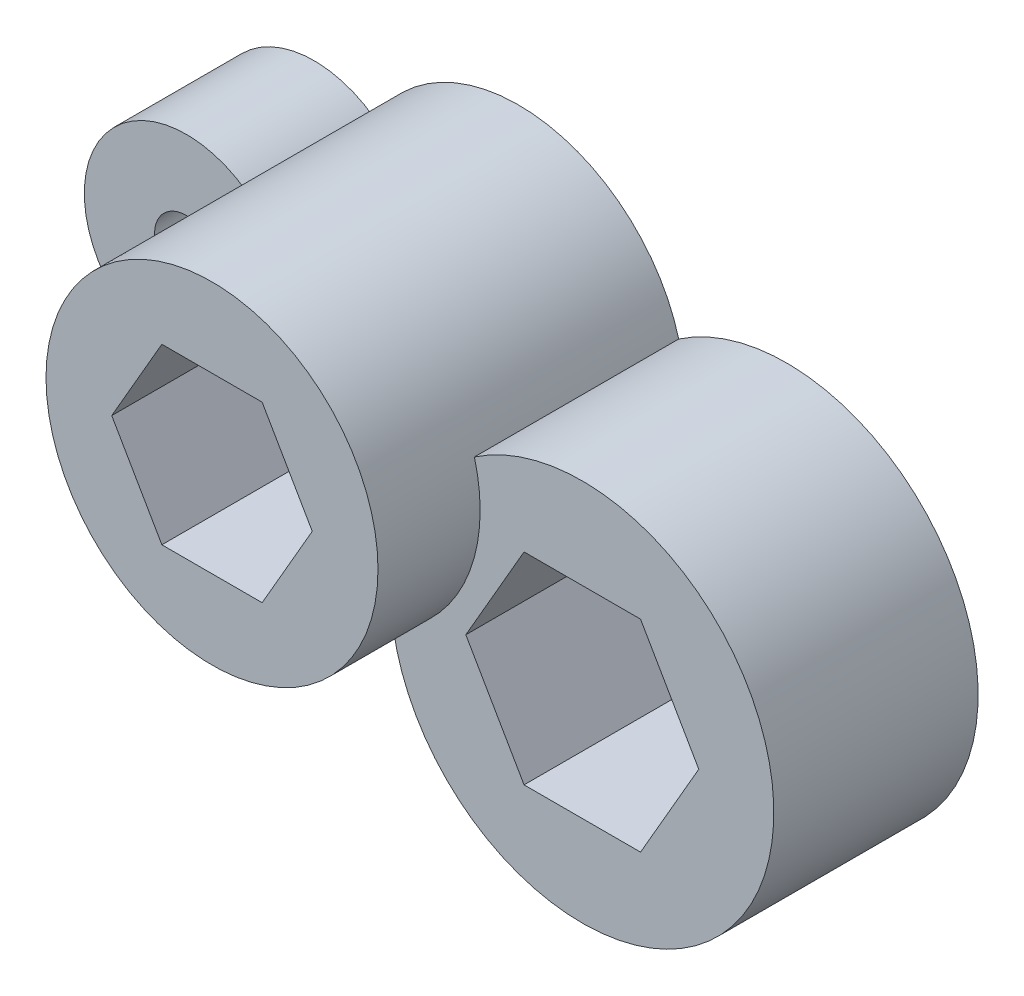
ISO-10303-21;
HEADER;
FILE_DESCRIPTION(('STEP AP214'),'2;1');
FILE_NAME('part.step','',(''),(''),'','','');
FILE_SCHEMA(('AUTOMOTIVE_DESIGN { 1 0 10303 214 1 1 1 1 }'));
ENDSEC;
DATA;
#1=APPLICATION_CONTEXT('core data for automotive mechanical design processes');
#2=APPLICATION_PROTOCOL_DEFINITION('international standard','automotive_design',2000,#1);
#3=PRODUCT_CONTEXT('',#1,'mechanical');
#4=PRODUCT('Part','Part','',(#3));
#5=PRODUCT_RELATED_PRODUCT_CATEGORY('part','',(#4));
#6=PRODUCT_DEFINITION_FORMATION('','',#4);
#7=PRODUCT_DEFINITION_CONTEXT('part definition',#1,'design');
#8=PRODUCT_DEFINITION('design','',#6,#7);
#9=PRODUCT_DEFINITION_SHAPE('','',#8);
#10=(LENGTH_UNIT() NAMED_UNIT(*) SI_UNIT(.MILLI.,.METRE.));
#11=(NAMED_UNIT(*) PLANE_ANGLE_UNIT() SI_UNIT($,.RADIAN.));
#12=(NAMED_UNIT(*) SI_UNIT($,.STERADIAN.) SOLID_ANGLE_UNIT());
#13=UNCERTAINTY_MEASURE_WITH_UNIT(LENGTH_MEASURE(1.E-05),#10,'distance_accuracy_value','');
#14=(GEOMETRIC_REPRESENTATION_CONTEXT(3) GLOBAL_UNCERTAINTY_ASSIGNED_CONTEXT((#13)) GLOBAL_UNIT_ASSIGNED_CONTEXT((#10,
#11,#12)) REPRESENTATION_CONTEXT('',''));
#15=CARTESIAN_POINT('',(0.,0.,0.));
#16=DIRECTION('',(0.,0.,1.));
#17=DIRECTION('',(1.,0.,0.));
#18=AXIS2_PLACEMENT_3D('',#15,#16,#17);
#19=CARTESIAN_POINT('',(0.,0.,8.));
#20=DIRECTION('',(0.,0.,-1.));
#21=DIRECTION('',(1.,0.,0.));
#22=AXIS2_PLACEMENT_3D('',#19,#20,#21);
#23=CYLINDRICAL_SURFACE('',#22,7.5);
#24=DIRECTION('',(0.,0.,-1.));
#25=VECTOR('',#24,1.);
#26=CARTESIAN_POINT('',(-7.40113444899148,-1.21375815875798,6.));
#27=LINE('',#26,#25);
#28=CARTESIAN_POINT('',(-7.40113444899148,-1.21375815875798,8.));
#29=VERTEX_POINT('',#28);
#30=CARTESIAN_POINT('',(-7.40113444899148,-1.21375815875798,0.));
#31=VERTEX_POINT('',#30);
#32=EDGE_CURVE('E173',#29,#31,#27,.T.);
#33=ORIENTED_EDGE('',*,*,#32,.T.);
#34=CARTESIAN_POINT('',(0.,0.,0.));
#35=DIRECTION('',(0.,0.,1.));
#36=DIRECTION('',(1.,0.,0.));
#37=AXIS2_PLACEMENT_3D('',#34,#35,#36);
#38=CIRCLE('',#37,7.5);
#39=CARTESIAN_POINT('',(-4.22530233261804,6.19651677944735,0.));
#40=VERTEX_POINT('',#39);
#41=EDGE_CURVE('E215',#31,#40,#38,.T.);
#42=ORIENTED_EDGE('',*,*,#41,.T.);
#43=DIRECTION('',(0.,0.,-1.));
#44=VECTOR('',#43,1.);
#45=CARTESIAN_POINT('',(-4.22530233261804,6.19651677944735,6.));
#46=LINE('',#45,#44);
#47=CARTESIAN_POINT('',(-4.22530233261804,6.19651677944735,8.));
#48=VERTEX_POINT('',#47);
#49=EDGE_CURVE('E162',#40,#48,#46,.F.);
#50=ORIENTED_EDGE('',*,*,#49,.T.);
#51=CARTESIAN_POINT('',(0.,0.,8.));
#52=DIRECTION('',(0.,0.,1.));
#53=DIRECTION('',(1.,0.,0.));
#54=AXIS2_PLACEMENT_3D('',#51,#52,#53);
#55=CIRCLE('',#54,7.5);
#56=EDGE_CURVE('E225',#29,#48,#55,.T.);
#57=ORIENTED_EDGE('',*,*,#56,.F.);
#58=EDGE_LOOP('',(#33,#42,#50,#57));
#59=FACE_BOUND('',#58,.T.);
#60=ADVANCED_FACE('F33',(#59),#23,.T.);
#61=CARTESIAN_POINT('',(0.,0.,8.));
#62=DIRECTION('',(0.,0.,-1.));
#63=DIRECTION('',(1.,0.,0.));
#64=AXIS2_PLACEMENT_3D('',#61,#62,#63);
#65=PLANE('',#64);
#66=DIRECTION('',(0.5,-0.866025403784439,0.));
#67=VECTOR('',#66,1.);
#68=CARTESIAN_POINT('',(-4.56106712659804,0.,8.));
#69=LINE('',#68,#67);
#70=CARTESIAN_POINT('',(-4.56106712659804,0.,8.));
#71=VERTEX_POINT('',#70);
#72=CARTESIAN_POINT('',(-2.28053356329902,-3.95,8.));
#73=VERTEX_POINT('',#72);
#74=EDGE_CURVE('E193',#71,#73,#69,.T.);
#75=ORIENTED_EDGE('',*,*,#74,.F.);
#76=DIRECTION('',(-0.5,-0.866025403784439,0.));
#77=VECTOR('',#76,1.);
#78=CARTESIAN_POINT('',(-2.28053356329902,3.95,8.));
#79=LINE('',#78,#77);
#80=CARTESIAN_POINT('',(-2.28053356329902,3.95,8.));
#81=VERTEX_POINT('',#80);
#82=EDGE_CURVE('E190',#81,#71,#79,.T.);
#83=ORIENTED_EDGE('',*,*,#82,.F.);
#84=DIRECTION('',(-1.,0.,0.));
#85=VECTOR('',#84,1.);
#86=CARTESIAN_POINT('',(2.28053356329902,3.95,8.));
#87=LINE('',#86,#85);
#88=CARTESIAN_POINT('',(2.28053356329902,3.95,8.));
#89=VERTEX_POINT('',#88);
#90=EDGE_CURVE('E187',#89,#81,#87,.T.);
#91=ORIENTED_EDGE('',*,*,#90,.F.);
#92=DIRECTION('',(-0.5,0.866025403784439,0.));
#93=VECTOR('',#92,1.);
#94=CARTESIAN_POINT('',(4.56106712659804,0.,8.));
#95=LINE('',#94,#93);
#96=CARTESIAN_POINT('',(4.56106712659804,0.,8.));
#97=VERTEX_POINT('',#96);
#98=EDGE_CURVE('E184',#97,#89,#95,.T.);
#99=ORIENTED_EDGE('',*,*,#98,.F.);
#100=DIRECTION('',(0.5,0.866025403784439,0.));
#101=VECTOR('',#100,1.);
#102=CARTESIAN_POINT('',(2.28053356329902,-3.95,8.));
#103=LINE('',#102,#101);
#104=CARTESIAN_POINT('',(2.28053356329902,-3.95,8.));
#105=VERTEX_POINT('',#104);
#106=EDGE_CURVE('E180',#105,#97,#103,.T.);
#107=ORIENTED_EDGE('',*,*,#106,.F.);
#108=DIRECTION('',(1.,0.,0.));
#109=VECTOR('',#108,1.);
#110=CARTESIAN_POINT('',(-2.28053356329902,-3.95,8.));
#111=LINE('',#110,#109);
#112=EDGE_CURVE('E177',#73,#105,#111,.T.);
#113=ORIENTED_EDGE('',*,*,#112,.F.);
#114=EDGE_LOOP('',(#75,#83,#91,#99,#107,#113));
#115=FACE_BOUND('',#114,.T.);
#116=ORIENTED_EDGE('',*,*,#56,.T.);
#117=CARTESIAN_POINT('',(-10.5000000000009,4.5,8.));
#118=DIRECTION('',(0.,0.,1.));
#119=DIRECTION('',(1.,0.,0.));
#120=AXIS2_PLACEMENT_3D('',#117,#118,#119);
#121=CIRCLE('',#120,6.50000000000048);
#122=EDGE_CURVE('E52',#29,#48,#121,.T.);
#123=ORIENTED_EDGE('',*,*,#122,.F.);
#124=EDGE_LOOP('',(#116,#123));
#125=FACE_BOUND('',#124,.T.);
#126=ADVANCED_FACE('F319',(#115,#125),#65,.F.);
#127=CARTESIAN_POINT('',(0.,0.,0.));
#128=DIRECTION('',(0.,0.,-1.));
#129=DIRECTION('',(1.,0.,0.));
#130=AXIS2_PLACEMENT_3D('',#127,#128,#129);
#131=PLANE('',#130);
#132=CARTESIAN_POINT('',(-10.5000000000009,4.5,0.));
#133=DIRECTION('',(0.,0.,1.));
#134=DIRECTION('',(1.,0.,0.));
#135=AXIS2_PLACEMENT_3D('',#132,#133,#134);
#136=CIRCLE('',#135,6.50000000000048);
#137=CARTESIAN_POINT('',(-16.1406250000013,7.73006959822488,0.));
#138=VERTEX_POINT('',#137);
#139=EDGE_CURVE('E155',#40,#138,#136,.T.);
#140=ORIENTED_EDGE('',*,*,#139,.F.);
#141=ORIENTED_EDGE('',*,*,#41,.F.);
#142=CARTESIAN_POINT('',(-16.1406250000013,1.26993040177507,0.));
#143=VERTEX_POINT('',#142);
#144=EDGE_CURVE('E156',#143,#31,#136,.T.);
#145=ORIENTED_EDGE('',*,*,#144,.F.);
#146=CARTESIAN_POINT('',(-18.5000000000009,4.49999999999996,0.));
#147=DIRECTION('',(0.,0.,1.));
#148=DIRECTION('',(1.,0.,0.));
#149=AXIS2_PLACEMENT_3D('',#146,#147,#148);
#150=CIRCLE('',#149,4.);
#151=EDGE_CURVE('E145',#138,#143,#150,.T.);
#152=ORIENTED_EDGE('',*,*,#151,.F.);
#153=EDGE_LOOP('',(#140,#141,#145,#152));
#154=FACE_BOUND('',#153,.T.);
#155=DIRECTION('',(1.,0.,0.));
#156=VECTOR('',#155,1.);
#157=CARTESIAN_POINT('',(-2.28053356329902,-3.95,0.));
#158=LINE('',#157,#156);
#159=CARTESIAN_POINT('',(-2.28053356329902,-3.95,0.));
#160=VERTEX_POINT('',#159);
#161=CARTESIAN_POINT('',(2.28053356329902,-3.95,0.));
#162=VERTEX_POINT('',#161);
#163=EDGE_CURVE('E176',#160,#162,#158,.T.);
#164=ORIENTED_EDGE('',*,*,#163,.T.);
#165=DIRECTION('',(0.5,0.866025403784439,0.));
#166=VECTOR('',#165,1.);
#167=CARTESIAN_POINT('',(2.28053356329902,-3.95,0.));
#168=LINE('',#167,#166);
#169=CARTESIAN_POINT('',(4.56106712659804,0.,0.));
#170=VERTEX_POINT('',#169);
#171=EDGE_CURVE('E199',#162,#170,#168,.T.);
#172=ORIENTED_EDGE('',*,*,#171,.T.);
#173=DIRECTION('',(-0.5,0.866025403784439,0.));
#174=VECTOR('',#173,1.);
#175=CARTESIAN_POINT('',(4.56106712659804,0.,0.));
#176=LINE('',#175,#174);
#177=CARTESIAN_POINT('',(2.28053356329902,3.95,0.));
#178=VERTEX_POINT('',#177);
#179=EDGE_CURVE('E202',#170,#178,#176,.T.);
#180=ORIENTED_EDGE('',*,*,#179,.T.);
#181=DIRECTION('',(-1.,0.,0.));
#182=VECTOR('',#181,1.);
#183=CARTESIAN_POINT('',(2.28053356329902,3.95,0.));
#184=LINE('',#183,#182);
#185=CARTESIAN_POINT('',(-2.28053356329902,3.95,0.));
#186=VERTEX_POINT('',#185);
#187=EDGE_CURVE('E205',#178,#186,#184,.T.);
#188=ORIENTED_EDGE('',*,*,#187,.T.);
#189=DIRECTION('',(-0.5,-0.866025403784439,0.));
#190=VECTOR('',#189,1.);
#191=CARTESIAN_POINT('',(-2.28053356329902,3.95,0.));
#192=LINE('',#191,#190);
#193=CARTESIAN_POINT('',(-4.56106712659804,0.,0.));
#194=VERTEX_POINT('',#193);
#195=EDGE_CURVE('E208',#186,#194,#192,.T.);
#196=ORIENTED_EDGE('',*,*,#195,.T.);
#197=DIRECTION('',(0.5,-0.866025403784439,0.));
#198=VECTOR('',#197,1.);
#199=CARTESIAN_POINT('',(-4.56106712659804,0.,0.));
#200=LINE('',#199,#198);
#201=EDGE_CURVE('E181',#194,#160,#200,.T.);
#202=ORIENTED_EDGE('',*,*,#201,.T.);
#203=EDGE_LOOP('',(#164,#172,#180,#188,#196,#202));
#204=FACE_BOUND('',#203,.T.);
#205=DIRECTION('',(1.,0.,0.));
#206=VECTOR('',#205,1.);
#207=CARTESIAN_POINT('',(-12.4629909152456,1.1,0.));
#208=LINE('',#207,#206);
#209=CARTESIAN_POINT('',(-12.4629909152456,1.1,0.));
#210=VERTEX_POINT('',#209);
#211=CARTESIAN_POINT('',(-8.53700908475617,1.1,0.));
#212=VERTEX_POINT('',#211);
#213=EDGE_CURVE('E231',#210,#212,#208,.T.);
#214=ORIENTED_EDGE('',*,*,#213,.T.);
#215=DIRECTION('',(0.5,0.866025403784439,0.));
#216=VECTOR('',#215,1.);
#217=CARTESIAN_POINT('',(-8.53700908475617,1.1,0.));
#218=LINE('',#217,#216);
#219=CARTESIAN_POINT('',(-6.57401816951144,4.5,0.));
#220=VERTEX_POINT('',#219);
#221=EDGE_CURVE('E234',#212,#220,#218,.T.);
#222=ORIENTED_EDGE('',*,*,#221,.T.);
#223=DIRECTION('',(-0.5,0.866025403784438,0.));
#224=VECTOR('',#223,1.);
#225=CARTESIAN_POINT('',(-6.57401816951144,4.5,0.));
#226=LINE('',#225,#224);
#227=CARTESIAN_POINT('',(-8.53700908475616,7.89999999999999,0.));
#228=VERTEX_POINT('',#227);
#229=EDGE_CURVE('E262',#220,#228,#226,.T.);
#230=ORIENTED_EDGE('',*,*,#229,.T.);
#231=DIRECTION('',(-1.,0.,0.));
#232=VECTOR('',#231,1.);
#233=CARTESIAN_POINT('',(-8.53700908475616,7.89999999999999,0.));
#234=LINE('',#233,#232);
#235=CARTESIAN_POINT('',(-12.4629909152453,7.89999999999999,0.));
#236=VERTEX_POINT('',#235);
#237=EDGE_CURVE('E265',#228,#236,#234,.T.);
#238=ORIENTED_EDGE('',*,*,#237,.T.);
#239=DIRECTION('',(-0.500000000000056,-0.866025403784406,0.));
#240=VECTOR('',#239,1.);
#241=CARTESIAN_POINT('',(-12.4629909152453,7.89999999999999,0.));
#242=LINE('',#241,#240);
#243=CARTESIAN_POINT('',(-14.4259818304903,4.5,0.));
#244=VERTEX_POINT('',#243);
#245=EDGE_CURVE('E268',#236,#244,#242,.T.);
#246=ORIENTED_EDGE('',*,*,#245,.T.);
#247=DIRECTION('',(0.5,-0.866025403784439,0.));
#248=VECTOR('',#247,1.);
#249=CARTESIAN_POINT('',(-14.4259818304903,4.5,0.));
#250=LINE('',#249,#248);
#251=EDGE_CURVE('E244',#244,#210,#250,.T.);
#252=ORIENTED_EDGE('',*,*,#251,.T.);
#253=EDGE_LOOP('',(#214,#222,#230,#238,#246,#252));
#254=FACE_BOUND('',#253,.T.);
#255=CARTESIAN_POINT('',(-18.5000000000009,4.49999999999996,0.));
#256=DIRECTION('',(0.,0.,1.));
#257=DIRECTION('',(1.,0.,0.));
#258=AXIS2_PLACEMENT_3D('',#255,#256,#257);
#259=CIRCLE('',#258,1.25000000000104);
#260=CARTESIAN_POINT('',(-17.2499999999999,4.49999999999996,0.));
#261=VERTEX_POINT('',#260);
#262=EDGE_CURVE('E237',#261,#261,#259,.T.);
#263=ORIENTED_EDGE('',*,*,#262,.T.);
#264=EDGE_LOOP('',(#263));
#265=FACE_BOUND('',#264,.T.);
#266=ADVANCED_FACE('F152',(#154,#204,#254,#265),#131,.T.);
#267=CARTESIAN_POINT('',(-2.28053356329902,-3.95,8.));
#268=DIRECTION('',(0.,-1.,0.));
#269=DIRECTION('',(1.,0.,0.));
#270=AXIS2_PLACEMENT_3D('',#267,#268,#269);
#271=PLANE('',#270);
#272=ORIENTED_EDGE('',*,*,#163,.F.);
#273=DIRECTION('',(0.,0.,-1.));
#274=VECTOR('',#273,1.);
#275=CARTESIAN_POINT('',(-2.28053356329902,-3.95,8.));
#276=LINE('',#275,#274);
#277=EDGE_CURVE('E213',#73,#160,#276,.T.);
#278=ORIENTED_EDGE('',*,*,#277,.F.);
#279=ORIENTED_EDGE('',*,*,#112,.T.);
#280=DIRECTION('',(0.,0.,-1.));
#281=VECTOR('',#280,1.);
#282=CARTESIAN_POINT('',(2.28053356329902,-3.95,8.));
#283=LINE('',#282,#281);
#284=EDGE_CURVE('E196',#105,#162,#283,.T.);
#285=ORIENTED_EDGE('',*,*,#284,.T.);
#286=EDGE_LOOP('',(#272,#278,#279,#285));
#287=FACE_BOUND('',#286,.T.);
#288=ADVANCED_FACE('F331',(#287),#271,.F.);
#289=CARTESIAN_POINT('',(-4.56106712659804,0.,8.));
#290=DIRECTION('',(-0.866025403784439,-0.5,0.));
#291=DIRECTION('',(0.5,-0.866025403784439,0.));
#292=AXIS2_PLACEMENT_3D('',#289,#290,#291);
#293=PLANE('',#292);
#294=ORIENTED_EDGE('',*,*,#201,.F.);
#295=DIRECTION('',(0.,0.,-1.));
#296=VECTOR('',#295,1.);
#297=CARTESIAN_POINT('',(-4.56106712659804,0.,8.));
#298=LINE('',#297,#296);
#299=EDGE_CURVE('E216',#71,#194,#298,.T.);
#300=ORIENTED_EDGE('',*,*,#299,.F.);
#301=ORIENTED_EDGE('',*,*,#74,.T.);
#302=ORIENTED_EDGE('',*,*,#277,.T.);
#303=EDGE_LOOP('',(#294,#300,#301,#302));
#304=FACE_BOUND('',#303,.T.);
#305=ADVANCED_FACE('F336',(#304),#293,.F.);
#306=CARTESIAN_POINT('',(-2.28053356329902,3.95,8.));
#307=DIRECTION('',(-0.866025403784439,0.5,0.));
#308=DIRECTION('',(-0.5,-0.866025403784439,0.));
#309=AXIS2_PLACEMENT_3D('',#306,#307,#308);
#310=PLANE('',#309);
#311=ORIENTED_EDGE('',*,*,#195,.F.);
#312=DIRECTION('',(0.,0.,-1.));
#313=VECTOR('',#312,1.);
#314=CARTESIAN_POINT('',(-2.28053356329902,3.95,8.));
#315=LINE('',#314,#313);
#316=EDGE_CURVE('E218',#81,#186,#315,.T.);
#317=ORIENTED_EDGE('',*,*,#316,.F.);
#318=ORIENTED_EDGE('',*,*,#82,.T.);
#319=ORIENTED_EDGE('',*,*,#299,.T.);
#320=EDGE_LOOP('',(#311,#317,#318,#319));
#321=FACE_BOUND('',#320,.T.);
#322=ADVANCED_FACE('F349',(#321),#310,.F.);
#323=CARTESIAN_POINT('',(2.28053356329902,3.95,8.));
#324=DIRECTION('',(0.,1.,0.));
#325=DIRECTION('',(-1.,0.,0.));
#326=AXIS2_PLACEMENT_3D('',#323,#324,#325);
#327=PLANE('',#326);
#328=ORIENTED_EDGE('',*,*,#187,.F.);
#329=DIRECTION('',(0.,0.,-1.));
#330=VECTOR('',#329,1.);
#331=CARTESIAN_POINT('',(2.28053356329902,3.95,8.));
#332=LINE('',#331,#330);
#333=EDGE_CURVE('E220',#89,#178,#332,.T.);
#334=ORIENTED_EDGE('',*,*,#333,.F.);
#335=ORIENTED_EDGE('',*,*,#90,.T.);
#336=ORIENTED_EDGE('',*,*,#316,.T.);
#337=EDGE_LOOP('',(#328,#334,#335,#336));
#338=FACE_BOUND('',#337,.T.);
#339=ADVANCED_FACE('F345',(#338),#327,.F.);
#340=CARTESIAN_POINT('',(4.56106712659804,0.,8.));
#341=DIRECTION('',(0.866025403784439,0.5,0.));
#342=DIRECTION('',(-0.5,0.866025403784439,0.));
#343=AXIS2_PLACEMENT_3D('',#340,#341,#342);
#344=PLANE('',#343);
#345=ORIENTED_EDGE('',*,*,#179,.F.);
#346=DIRECTION('',(0.,0.,-1.));
#347=VECTOR('',#346,1.);
#348=CARTESIAN_POINT('',(4.56106712659804,0.,8.));
#349=LINE('',#348,#347);
#350=EDGE_CURVE('E222',#97,#170,#349,.T.);
#351=ORIENTED_EDGE('',*,*,#350,.F.);
#352=ORIENTED_EDGE('',*,*,#98,.T.);
#353=ORIENTED_EDGE('',*,*,#333,.T.);
#354=EDGE_LOOP('',(#345,#351,#352,#353));
#355=FACE_BOUND('',#354,.T.);
#356=ADVANCED_FACE('F341',(#355),#344,.F.);
#357=CARTESIAN_POINT('',(2.28053356329902,-3.95,8.));
#358=DIRECTION('',(0.866025403784439,-0.5,0.));
#359=DIRECTION('',(0.5,0.866025403784439,0.));
#360=AXIS2_PLACEMENT_3D('',#357,#358,#359);
#361=PLANE('',#360);
#362=ORIENTED_EDGE('',*,*,#171,.F.);
#363=ORIENTED_EDGE('',*,*,#284,.F.);
#364=ORIENTED_EDGE('',*,*,#106,.T.);
#365=ORIENTED_EDGE('',*,*,#350,.T.);
#366=EDGE_LOOP('',(#362,#363,#364,#365));
#367=FACE_BOUND('',#366,.T.);
#368=ADVANCED_FACE('F338',(#367),#361,.F.);
#369=CARTESIAN_POINT('',(-10.5000000000009,4.5,12.));
#370=DIRECTION('',(0.,0.,-1.));
#371=DIRECTION('',(1.,0.,0.));
#372=AXIS2_PLACEMENT_3D('',#369,#370,#371);
#373=CYLINDRICAL_SURFACE('',#372,6.50000000000048);
#374=DIRECTION('',(0.,0.,-1.));
#375=VECTOR('',#374,1.);
#376=CARTESIAN_POINT('',(-16.1406250000013,1.26993040177507,2.5));
#377=LINE('',#376,#375);
#378=CARTESIAN_POINT('',(-16.1406250000013,1.26993040177506,5.));
#379=VERTEX_POINT('',#378);
#380=EDGE_CURVE('E11',#379,#143,#377,.T.);
#381=ORIENTED_EDGE('',*,*,#380,.T.);
#382=ORIENTED_EDGE('',*,*,#144,.T.);
#383=ORIENTED_EDGE('',*,*,#32,.F.);
#384=ORIENTED_EDGE('',*,*,#122,.T.);
#385=ORIENTED_EDGE('',*,*,#49,.F.);
#386=ORIENTED_EDGE('',*,*,#139,.T.);
#387=DIRECTION('',(0.,0.,-1.));
#388=VECTOR('',#387,1.);
#389=CARTESIAN_POINT('',(-16.1406250000013,7.73006959822488,2.5));
#390=LINE('',#389,#388);
#391=CARTESIAN_POINT('',(-16.1406250000013,7.73006959822488,5.));
#392=VERTEX_POINT('',#391);
#393=EDGE_CURVE('E40',#138,#392,#390,.F.);
#394=ORIENTED_EDGE('',*,*,#393,.T.);
#395=CARTESIAN_POINT('',(-10.5000000000009,4.5,5.));
#396=DIRECTION('',(0.,0.,1.));
#397=DIRECTION('',(1.,0.,0.));
#398=AXIS2_PLACEMENT_3D('',#395,#396,#397);
#399=CIRCLE('',#398,6.50000000000048);
#400=EDGE_CURVE('E150',#379,#392,#399,.F.);
#401=ORIENTED_EDGE('',*,*,#400,.F.);
#402=EDGE_LOOP('',(#381,#382,#383,#384,#385,#386,#394,#401));
#403=FACE_BOUND('',#402,.T.);
#404=CARTESIAN_POINT('',(-10.5000000000009,4.5,12.));
#405=DIRECTION('',(0.,0.,1.));
#406=DIRECTION('',(1.,0.,0.));
#407=AXIS2_PLACEMENT_3D('',#404,#405,#406);
#408=CIRCLE('',#407,6.50000000000048);
#409=CARTESIAN_POINT('',(-4.00000000000041,4.5,12.));
#410=VERTEX_POINT('',#409);
#411=EDGE_CURVE('E164',#410,#410,#408,.T.);
#412=ORIENTED_EDGE('',*,*,#411,.F.);
#413=EDGE_LOOP('',(#412));
#414=FACE_BOUND('',#413,.T.);
#415=ADVANCED_FACE('F159',(#403,#414),#373,.T.);
#416=CARTESIAN_POINT('',(-10.5000000000009,4.5,12.));
#417=DIRECTION('',(0.,0.,-1.));
#418=DIRECTION('',(1.,0.,0.));
#419=AXIS2_PLACEMENT_3D('',#416,#417,#418);
#420=PLANE('',#419);
#421=DIRECTION('',(0.5,-0.866025403784439,0.));
#422=VECTOR('',#421,1.);
#423=CARTESIAN_POINT('',(-14.4259818304903,4.5,12.));
#424=LINE('',#423,#422);
#425=CARTESIAN_POINT('',(-14.4259818304903,4.5,12.));
#426=VERTEX_POINT('',#425);
#427=CARTESIAN_POINT('',(-12.4629909152456,1.1,12.));
#428=VERTEX_POINT('',#427);
#429=EDGE_CURVE('E256',#426,#428,#424,.T.);
#430=ORIENTED_EDGE('',*,*,#429,.F.);
#431=DIRECTION('',(-0.500000000000056,-0.866025403784406,0.));
#432=VECTOR('',#431,1.);
#433=CARTESIAN_POINT('',(-12.4629909152453,7.89999999999999,12.));
#434=LINE('',#433,#432);
#435=CARTESIAN_POINT('',(-12.4629909152453,7.89999999999999,12.));
#436=VERTEX_POINT('',#435);
#437=EDGE_CURVE('E253',#436,#426,#434,.T.);
#438=ORIENTED_EDGE('',*,*,#437,.F.);
#439=DIRECTION('',(-1.,0.,0.));
#440=VECTOR('',#439,1.);
#441=CARTESIAN_POINT('',(-8.53700908475616,7.89999999999999,12.));
#442=LINE('',#441,#440);
#443=CARTESIAN_POINT('',(-8.53700908475616,7.89999999999999,12.));
#444=VERTEX_POINT('',#443);
#445=EDGE_CURVE('E250',#444,#436,#442,.T.);
#446=ORIENTED_EDGE('',*,*,#445,.F.);
#447=DIRECTION('',(-0.5,0.866025403784438,0.));
#448=VECTOR('',#447,1.);
#449=CARTESIAN_POINT('',(-6.57401816951144,4.5,12.));
#450=LINE('',#449,#448);
#451=CARTESIAN_POINT('',(-6.57401816951144,4.5,12.));
#452=VERTEX_POINT('',#451);
#453=EDGE_CURVE('E247',#452,#444,#450,.T.);
#454=ORIENTED_EDGE('',*,*,#453,.F.);
#455=DIRECTION('',(0.5,0.866025403784439,0.));
#456=VECTOR('',#455,1.);
#457=CARTESIAN_POINT('',(-8.53700908475617,1.1,12.));
#458=LINE('',#457,#456);
#459=CARTESIAN_POINT('',(-8.53700908475617,1.1,12.));
#460=VERTEX_POINT('',#459);
#461=EDGE_CURVE('E243',#460,#452,#458,.T.);
#462=ORIENTED_EDGE('',*,*,#461,.F.);
#463=DIRECTION('',(1.,0.,0.));
#464=VECTOR('',#463,1.);
#465=CARTESIAN_POINT('',(-12.4629909152456,1.1,12.));
#466=LINE('',#465,#464);
#467=EDGE_CURVE('E240',#428,#460,#466,.T.);
#468=ORIENTED_EDGE('',*,*,#467,.F.);
#469=EDGE_LOOP('',(#430,#438,#446,#454,#462,#468));
#470=FACE_BOUND('',#469,.T.);
#471=ORIENTED_EDGE('',*,*,#411,.T.);
#472=EDGE_LOOP('',(#471));
#473=FACE_BOUND('',#472,.T.);
#474=ADVANCED_FACE('F298',(#470,#473),#420,.F.);
#475=CARTESIAN_POINT('',(-12.4629909152456,1.1,12.));
#476=DIRECTION('',(0.,-1.,0.));
#477=DIRECTION('',(1.,0.,0.));
#478=AXIS2_PLACEMENT_3D('',#475,#476,#477);
#479=PLANE('',#478);
#480=ORIENTED_EDGE('',*,*,#213,.F.);
#481=DIRECTION('',(0.,0.,-1.));
#482=VECTOR('',#481,1.);
#483=CARTESIAN_POINT('',(-12.4629909152456,1.1,12.));
#484=LINE('',#483,#482);
#485=EDGE_CURVE('E168',#428,#210,#484,.T.);
#486=ORIENTED_EDGE('',*,*,#485,.F.);
#487=ORIENTED_EDGE('',*,*,#467,.T.);
#488=DIRECTION('',(0.,0.,-1.));
#489=VECTOR('',#488,1.);
#490=CARTESIAN_POINT('',(-8.53700908475617,1.1,12.));
#491=LINE('',#490,#489);
#492=EDGE_CURVE('E258',#460,#212,#491,.T.);
#493=ORIENTED_EDGE('',*,*,#492,.T.);
#494=EDGE_LOOP('',(#480,#486,#487,#493));
#495=FACE_BOUND('',#494,.T.);
#496=ADVANCED_FACE('F284',(#495),#479,.F.);
#497=CARTESIAN_POINT('',(-14.4259818304903,4.5,12.));
#498=DIRECTION('',(-0.866025403784439,-0.5,0.));
#499=DIRECTION('',(0.5,-0.866025403784439,0.));
#500=AXIS2_PLACEMENT_3D('',#497,#498,#499);
#501=PLANE('',#500);
#502=ORIENTED_EDGE('',*,*,#251,.F.);
#503=DIRECTION('',(0.,0.,-1.));
#504=VECTOR('',#503,1.);
#505=CARTESIAN_POINT('',(-14.4259818304903,4.5,12.));
#506=LINE('',#505,#504);
#507=EDGE_CURVE('E274',#426,#244,#506,.T.);
#508=ORIENTED_EDGE('',*,*,#507,.F.);
#509=ORIENTED_EDGE('',*,*,#429,.T.);
#510=ORIENTED_EDGE('',*,*,#485,.T.);
#511=EDGE_LOOP('',(#502,#508,#509,#510));
#512=FACE_BOUND('',#511,.T.);
#513=ADVANCED_FACE('F295',(#512),#501,.F.);
#514=CARTESIAN_POINT('',(-12.4629909152453,7.89999999999999,12.));
#515=DIRECTION('',(-0.866025403784406,0.500000000000056,0.));
#516=DIRECTION('',(-0.500000000000056,-0.866025403784406,0.));
#517=AXIS2_PLACEMENT_3D('',#514,#515,#516);
#518=PLANE('',#517);
#519=ORIENTED_EDGE('',*,*,#245,.F.);
#520=DIRECTION('',(0.,0.,-1.));
#521=VECTOR('',#520,1.);
#522=CARTESIAN_POINT('',(-12.4629909152453,7.89999999999999,12.));
#523=LINE('',#522,#521);
#524=EDGE_CURVE('E276',#436,#236,#523,.T.);
#525=ORIENTED_EDGE('',*,*,#524,.F.);
#526=ORIENTED_EDGE('',*,*,#437,.T.);
#527=ORIENTED_EDGE('',*,*,#507,.T.);
#528=EDGE_LOOP('',(#519,#525,#526,#527));
#529=FACE_BOUND('',#528,.T.);
#530=ADVANCED_FACE('F309',(#529),#518,.F.);
#531=CARTESIAN_POINT('',(-8.53700908475616,7.89999999999999,12.));
#532=DIRECTION('',(0.,1.,0.));
#533=DIRECTION('',(0.,0.,-1.));
#534=AXIS2_PLACEMENT_3D('',#531,#532,#533);
#535=PLANE('',#534);
#536=ORIENTED_EDGE('',*,*,#237,.F.);
#537=DIRECTION('',(0.,0.,-1.));
#538=VECTOR('',#537,1.);
#539=CARTESIAN_POINT('',(-8.53700908475616,7.89999999999999,12.));
#540=LINE('',#539,#538);
#541=EDGE_CURVE('E278',#444,#228,#540,.T.);
#542=ORIENTED_EDGE('',*,*,#541,.F.);
#543=ORIENTED_EDGE('',*,*,#445,.T.);
#544=ORIENTED_EDGE('',*,*,#524,.T.);
#545=EDGE_LOOP('',(#536,#542,#543,#544));
#546=FACE_BOUND('',#545,.T.);
#547=ADVANCED_FACE('F307',(#546),#535,.F.);
#548=CARTESIAN_POINT('',(-6.57401816951144,4.5,12.));
#549=DIRECTION('',(0.866025403784439,0.5,0.));
#550=DIRECTION('',(-0.5,0.866025403784439,0.));
#551=AXIS2_PLACEMENT_3D('',#548,#549,#550);
#552=PLANE('',#551);
#553=ORIENTED_EDGE('',*,*,#229,.F.);
#554=DIRECTION('',(0.,0.,-1.));
#555=VECTOR('',#554,1.);
#556=CARTESIAN_POINT('',(-6.57401816951144,4.5,12.));
#557=LINE('',#556,#555);
#558=EDGE_CURVE('E280',#452,#220,#557,.T.);
#559=ORIENTED_EDGE('',*,*,#558,.F.);
#560=ORIENTED_EDGE('',*,*,#453,.T.);
#561=ORIENTED_EDGE('',*,*,#541,.T.);
#562=EDGE_LOOP('',(#553,#559,#560,#561));
#563=FACE_BOUND('',#562,.T.);
#564=ADVANCED_FACE('F304',(#563),#552,.F.);
#565=CARTESIAN_POINT('',(-8.53700908475617,1.1,12.));
#566=DIRECTION('',(0.866025403784439,-0.5,0.));
#567=DIRECTION('',(0.5,0.866025403784439,0.));
#568=AXIS2_PLACEMENT_3D('',#565,#566,#567);
#569=PLANE('',#568);
#570=ORIENTED_EDGE('',*,*,#221,.F.);
#571=ORIENTED_EDGE('',*,*,#492,.F.);
#572=ORIENTED_EDGE('',*,*,#461,.T.);
#573=ORIENTED_EDGE('',*,*,#558,.T.);
#574=EDGE_LOOP('',(#570,#571,#572,#573));
#575=FACE_BOUND('',#574,.T.);
#576=ADVANCED_FACE('F288',(#575),#569,.F.);
#577=CARTESIAN_POINT('',(-18.5000000000009,4.49999999999996,5.));
#578=DIRECTION('',(0.,0.,-1.));
#579=DIRECTION('',(1.,0.,0.));
#580=AXIS2_PLACEMENT_3D('',#577,#578,#579);
#581=CYLINDRICAL_SURFACE('',#580,4.);
#582=CARTESIAN_POINT('',(-18.5000000000009,4.49999999999996,5.));
#583=DIRECTION('',(0.,0.,1.));
#584=DIRECTION('',(1.,0.,0.));
#585=AXIS2_PLACEMENT_3D('',#582,#583,#584);
#586=CIRCLE('',#585,4.);
#587=EDGE_CURVE('E147',#392,#379,#586,.T.);
#588=ORIENTED_EDGE('',*,*,#587,.F.);
#589=ORIENTED_EDGE('',*,*,#393,.F.);
#590=ORIENTED_EDGE('',*,*,#151,.T.);
#591=ORIENTED_EDGE('',*,*,#380,.F.);
#592=EDGE_LOOP('',(#588,#589,#590,#591));
#593=FACE_BOUND('',#592,.T.);
#594=ADVANCED_FACE('F144',(#593),#581,.T.);
#595=CARTESIAN_POINT('',(-18.5000000000009,4.49999999999996,5.));
#596=DIRECTION('',(0.,0.,-1.));
#597=DIRECTION('',(1.,0.,0.));
#598=AXIS2_PLACEMENT_3D('',#595,#596,#597);
#599=PLANE('',#598);
#600=ORIENTED_EDGE('',*,*,#400,.T.);
#601=ORIENTED_EDGE('',*,*,#587,.T.);
#602=EDGE_LOOP('',(#600,#601));
#603=FACE_BOUND('',#602,.T.);
#604=CARTESIAN_POINT('',(-18.5000000000009,4.49999999999996,5.));
#605=DIRECTION('',(0.,0.,1.));
#606=DIRECTION('',(1.,0.,0.));
#607=AXIS2_PLACEMENT_3D('',#604,#605,#606);
#608=CIRCLE('',#607,1.25000000000104);
#609=CARTESIAN_POINT('',(-17.2499999999999,4.49999999999996,5.));
#610=VERTEX_POINT('',#609);
#611=EDGE_CURVE('E157',#610,#610,#608,.T.);
#612=ORIENTED_EDGE('',*,*,#611,.F.);
#613=EDGE_LOOP('',(#612));
#614=FACE_BOUND('',#613,.T.);
#615=ADVANCED_FACE('F229',(#603,#614),#599,.F.);
#616=CARTESIAN_POINT('',(-18.5000000000009,4.49999999999996,5.));
#617=DIRECTION('',(0.,0.,-1.));
#618=DIRECTION('',(1.,0.,0.));
#619=AXIS2_PLACEMENT_3D('',#616,#617,#618);
#620=CYLINDRICAL_SURFACE('',#619,1.25000000000104);
#621=ORIENTED_EDGE('',*,*,#611,.T.);
#622=EDGE_LOOP('',(#621));
#623=FACE_BOUND('',#622,.T.);
#624=ORIENTED_EDGE('',*,*,#262,.F.);
#625=EDGE_LOOP('',(#624));
#626=FACE_BOUND('',#625,.T.);
#627=ADVANCED_FACE('F386',(#623,#626),#620,.F.);
#628=CLOSED_SHELL('',(#60,#126,#266,#288,#305,#322,#339,#356,#368,#415,#474,#496,#513,#530,#547,
#564,#576,#594,#615,#627));
#629=MANIFOLD_SOLID_BREP('B2',#628);
#630=ADVANCED_BREP_SHAPE_REPRESENTATION('',(#18,#629),#14);
#631=SHAPE_DEFINITION_REPRESENTATION(#9,#630);
ENDSEC;
END-ISO-10303-21;
